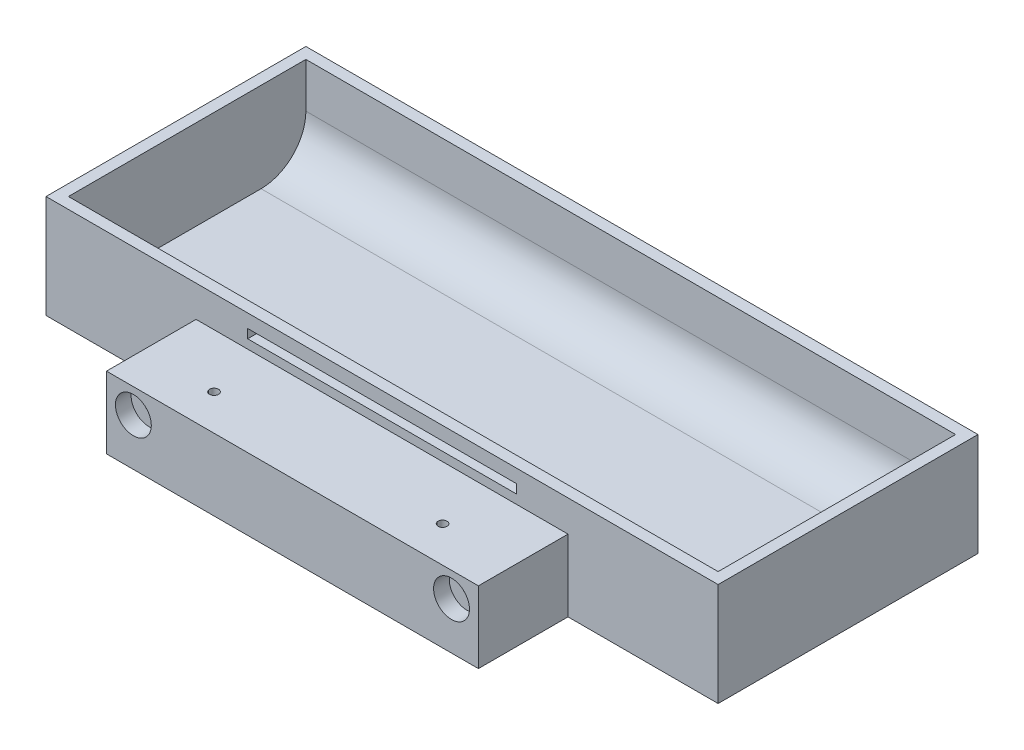
ISO-10303-21;
HEADER;
FILE_DESCRIPTION(('STEP AP214'),'2;1');
FILE_NAME('part.step','',(''),(''),'','','');
FILE_SCHEMA(('AUTOMOTIVE_DESIGN { 1 0 10303 214 1 1 1 1 }'));
ENDSEC;
DATA;
#1=APPLICATION_CONTEXT('core data for automotive mechanical design processes');
#2=APPLICATION_PROTOCOL_DEFINITION('international standard','automotive_design',2000,#1);
#3=PRODUCT_CONTEXT('',#1,'mechanical');
#4=PRODUCT('Part','Part','',(#3));
#5=PRODUCT_RELATED_PRODUCT_CATEGORY('part','',(#4));
#6=PRODUCT_DEFINITION_FORMATION('','',#4);
#7=PRODUCT_DEFINITION_CONTEXT('part definition',#1,'design');
#8=PRODUCT_DEFINITION('design','',#6,#7);
#9=PRODUCT_DEFINITION_SHAPE('','',#8);
#10=(LENGTH_UNIT() NAMED_UNIT(*) SI_UNIT(.MILLI.,.METRE.));
#11=(NAMED_UNIT(*) PLANE_ANGLE_UNIT() SI_UNIT($,.RADIAN.));
#12=(NAMED_UNIT(*) SI_UNIT($,.STERADIAN.) SOLID_ANGLE_UNIT());
#13=UNCERTAINTY_MEASURE_WITH_UNIT(LENGTH_MEASURE(1.E-05),#10,'distance_accuracy_value','');
#14=(GEOMETRIC_REPRESENTATION_CONTEXT(3) GLOBAL_UNCERTAINTY_ASSIGNED_CONTEXT((#13)) GLOBAL_UNIT_ASSIGNED_CONTEXT((#10,
#11,#12)) REPRESENTATION_CONTEXT('',''));
#15=CARTESIAN_POINT('',(0.,0.,0.));
#16=DIRECTION('',(0.,0.,1.));
#17=DIRECTION('',(1.,0.,0.));
#18=AXIS2_PLACEMENT_3D('',#15,#16,#17);
#19=CARTESIAN_POINT('',(0.,0.,-10.));
#20=DIRECTION('',(0.,0.,-1.));
#21=DIRECTION('',(-1.,0.,0.));
#22=AXIS2_PLACEMENT_3D('',#19,#20,#21);
#23=PLANE('',#22);
#24=DIRECTION('',(0.,-1.,0.));
#25=VECTOR('',#24,1.);
#26=CARTESIAN_POINT('',(75.,3.,-10.));
#27=LINE('',#26,#25);
#28=CARTESIAN_POINT('',(75.,23.,-10.));
#29=VERTEX_POINT('',#28);
#30=CARTESIAN_POINT('',(75.,0.,-10.));
#31=VERTEX_POINT('',#30);
#32=EDGE_CURVE('E300',#29,#31,#27,.T.);
#33=ORIENTED_EDGE('',*,*,#32,.F.);
#34=DIRECTION('',(1.,0.,0.));
#35=VECTOR('',#34,1.);
#36=CARTESIAN_POINT('',(-75.,23.,-10.));
#37=LINE('',#36,#35);
#38=CARTESIAN_POINT('',(-75.,23.,-10.));
#39=VERTEX_POINT('',#38);
#40=EDGE_CURVE('E281',#39,#29,#37,.T.);
#41=ORIENTED_EDGE('',*,*,#40,.F.);
#42=DIRECTION('',(0.,1.,0.));
#43=VECTOR('',#42,1.);
#44=CARTESIAN_POINT('',(-75.,3.,-10.));
#45=LINE('',#44,#43);
#46=CARTESIAN_POINT('',(-75.,0.,-10.));
#47=VERTEX_POINT('',#46);
#48=EDGE_CURVE('E290',#47,#39,#45,.T.);
#49=ORIENTED_EDGE('',*,*,#48,.F.);
#50=DIRECTION('',(-1.,0.,0.));
#51=VECTOR('',#50,1.);
#52=CARTESIAN_POINT('',(75.,0.,-10.));
#53=LINE('',#52,#51);
#54=CARTESIAN_POINT('',(-41.5,0.,-10.));
#55=VERTEX_POINT('',#54);
#56=EDGE_CURVE('E302',#55,#47,#53,.T.);
#57=ORIENTED_EDGE('',*,*,#56,.F.);
#58=DIRECTION('',(0.,-1.,0.));
#59=VECTOR('',#58,1.);
#60=CARTESIAN_POINT('',(-41.5,16.,-10.));
#61=LINE('',#60,#59);
#62=CARTESIAN_POINT('',(-41.5,16.,-10.));
#63=VERTEX_POINT('',#62);
#64=EDGE_CURVE('E367',#63,#55,#61,.T.);
#65=ORIENTED_EDGE('',*,*,#64,.F.);
#66=DIRECTION('',(-1.,0.,0.));
#67=VECTOR('',#66,1.);
#68=CARTESIAN_POINT('',(-41.5,16.,-10.));
#69=LINE('',#68,#67);
#70=CARTESIAN_POINT('',(41.5,16.,-10.));
#71=VERTEX_POINT('',#70);
#72=EDGE_CURVE('E349',#71,#63,#69,.T.);
#73=ORIENTED_EDGE('',*,*,#72,.F.);
#74=DIRECTION('',(0.,-1.,0.));
#75=VECTOR('',#74,1.);
#76=CARTESIAN_POINT('',(41.5,16.,-10.));
#77=LINE('',#76,#75);
#78=CARTESIAN_POINT('',(41.5,0.,-10.));
#79=VERTEX_POINT('',#78);
#80=EDGE_CURVE('E369',#71,#79,#77,.T.);
#81=ORIENTED_EDGE('',*,*,#80,.T.);
#82=EDGE_CURVE('E294',#31,#79,#53,.T.);
#83=ORIENTED_EDGE('',*,*,#82,.F.);
#84=EDGE_LOOP('',(#33,#41,#49,#57,#65,#73,#81,#83));
#85=FACE_BOUND('',#84,.T.);
#86=DIRECTION('',(0.,1.,0.));
#87=VECTOR('',#86,1.);
#88=CARTESIAN_POINT('',(30.,18.,-10.));
#89=LINE('',#88,#87);
#90=CARTESIAN_POINT('',(30.,18.,-10.));
#91=VERTEX_POINT('',#90);
#92=CARTESIAN_POINT('',(30.,20.,-10.));
#93=VERTEX_POINT('',#92);
#94=EDGE_CURVE('E233',#91,#93,#89,.T.);
#95=ORIENTED_EDGE('',*,*,#94,.F.);
#96=DIRECTION('',(-1.,0.,0.));
#97=VECTOR('',#96,1.);
#98=CARTESIAN_POINT('',(30.,18.,-10.));
#99=LINE('',#98,#97);
#100=CARTESIAN_POINT('',(-30.,18.,-10.));
#101=VERTEX_POINT('',#100);
#102=EDGE_CURVE('E226',#91,#101,#99,.T.);
#103=ORIENTED_EDGE('',*,*,#102,.T.);
#104=DIRECTION('',(0.,1.,0.));
#105=VECTOR('',#104,1.);
#106=CARTESIAN_POINT('',(-30.,18.,-10.));
#107=LINE('',#106,#105);
#108=CARTESIAN_POINT('',(-30.,20.,-10.));
#109=VERTEX_POINT('',#108);
#110=EDGE_CURVE('E237',#101,#109,#107,.T.);
#111=ORIENTED_EDGE('',*,*,#110,.T.);
#112=DIRECTION('',(-1.,0.,0.));
#113=VECTOR('',#112,1.);
#114=CARTESIAN_POINT('',(30.,20.,-10.));
#115=LINE('',#114,#113);
#116=EDGE_CURVE('E219',#93,#109,#115,.T.);
#117=ORIENTED_EDGE('',*,*,#116,.F.);
#118=EDGE_LOOP('',(#95,#103,#111,#117));
#119=FACE_BOUND('',#118,.T.);
#120=ADVANCED_FACE('F39',(#85,#119),#23,.F.);
#121=CARTESIAN_POINT('',(41.5,16.,-10.));
#122=DIRECTION('',(-1.,0.,0.));
#123=DIRECTION('',(0.,0.,1.));
#124=AXIS2_PLACEMENT_3D('',#121,#122,#123);
#125=PLANE('',#124);
#126=DIRECTION('',(0.,0.,-1.));
#127=VECTOR('',#126,1.);
#128=CARTESIAN_POINT('',(41.5,0.,-10.));
#129=LINE('',#128,#127);
#130=CARTESIAN_POINT('',(41.5,0.,10.));
#131=VERTEX_POINT('',#130);
#132=EDGE_CURVE('E338',#131,#79,#129,.T.);
#133=ORIENTED_EDGE('',*,*,#132,.T.);
#134=ORIENTED_EDGE('',*,*,#80,.F.);
#135=DIRECTION('',(0.,0.,-1.));
#136=VECTOR('',#135,1.);
#137=CARTESIAN_POINT('',(41.5,16.,-10.));
#138=LINE('',#137,#136);
#139=CARTESIAN_POINT('',(41.5,16.,10.));
#140=VERTEX_POINT('',#139);
#141=EDGE_CURVE('E347',#140,#71,#138,.T.);
#142=ORIENTED_EDGE('',*,*,#141,.F.);
#143=DIRECTION('',(0.,-1.,0.));
#144=VECTOR('',#143,1.);
#145=CARTESIAN_POINT('',(41.5,16.,10.));
#146=LINE('',#145,#144);
#147=EDGE_CURVE('E356',#140,#131,#146,.T.);
#148=ORIENTED_EDGE('',*,*,#147,.T.);
#149=EDGE_LOOP('',(#133,#134,#142,#148));
#150=FACE_BOUND('',#149,.T.);
#151=ADVANCED_FACE('F424',(#150),#125,.F.);
#152=CARTESIAN_POINT('',(-41.5,16.,-10.));
#153=DIRECTION('',(1.,0.,0.));
#154=DIRECTION('',(0.,0.,-1.));
#155=AXIS2_PLACEMENT_3D('',#152,#153,#154);
#156=PLANE('',#155);
#157=DIRECTION('',(0.,0.,1.));
#158=VECTOR('',#157,1.);
#159=CARTESIAN_POINT('',(-41.5,0.,-10.));
#160=LINE('',#159,#158);
#161=CARTESIAN_POINT('',(-41.5,0.,10.));
#162=VERTEX_POINT('',#161);
#163=EDGE_CURVE('E359',#55,#162,#160,.T.);
#164=ORIENTED_EDGE('',*,*,#163,.T.);
#165=DIRECTION('',(0.,-1.,0.));
#166=VECTOR('',#165,1.);
#167=CARTESIAN_POINT('',(-41.5,16.,10.));
#168=LINE('',#167,#166);
#169=CARTESIAN_POINT('',(-41.5,16.,10.));
#170=VERTEX_POINT('',#169);
#171=EDGE_CURVE('E364',#170,#162,#168,.T.);
#172=ORIENTED_EDGE('',*,*,#171,.F.);
#173=DIRECTION('',(0.,0.,1.));
#174=VECTOR('',#173,1.);
#175=CARTESIAN_POINT('',(-41.5,16.,-10.));
#176=LINE('',#175,#174);
#177=EDGE_CURVE('E352',#63,#170,#176,.T.);
#178=ORIENTED_EDGE('',*,*,#177,.F.);
#179=ORIENTED_EDGE('',*,*,#64,.T.);
#180=EDGE_LOOP('',(#164,#172,#178,#179));
#181=FACE_BOUND('',#180,.T.);
#182=ADVANCED_FACE('F431',(#181),#156,.F.);
#183=CARTESIAN_POINT('',(-41.5,16.,10.));
#184=DIRECTION('',(0.,0.,-1.));
#185=DIRECTION('',(-1.,0.,0.));
#186=AXIS2_PLACEMENT_3D('',#183,#184,#185);
#187=PLANE('',#186);
#188=CARTESIAN_POINT('',(-35.5,10.5,10.));
#189=DIRECTION('',(0.,0.,1.));
#190=DIRECTION('',(1.,0.,0.));
#191=AXIS2_PLACEMENT_3D('',#188,#189,#190);
#192=CIRCLE('',#191,4.00000000000001);
#193=CARTESIAN_POINT('',(-31.5,10.5,10.));
#194=VERTEX_POINT('',#193);
#195=EDGE_CURVE('E339',#194,#194,#192,.T.);
#196=ORIENTED_EDGE('',*,*,#195,.F.);
#197=EDGE_LOOP('',(#196));
#198=FACE_BOUND('',#197,.T.);
#199=CARTESIAN_POINT('',(35.5,10.5,10.));
#200=DIRECTION('',(0.,0.,1.));
#201=DIRECTION('',(1.,0.,0.));
#202=AXIS2_PLACEMENT_3D('',#199,#200,#201);
#203=CIRCLE('',#202,4.00000000000001);
#204=CARTESIAN_POINT('',(39.5,10.5,10.));
#205=VERTEX_POINT('',#204);
#206=EDGE_CURVE('E342',#205,#205,#203,.T.);
#207=ORIENTED_EDGE('',*,*,#206,.F.);
#208=EDGE_LOOP('',(#207));
#209=FACE_BOUND('',#208,.T.);
#210=DIRECTION('',(1.,0.,0.));
#211=VECTOR('',#210,1.);
#212=CARTESIAN_POINT('',(-41.5,0.,10.));
#213=LINE('',#212,#211);
#214=EDGE_CURVE('E350',#162,#131,#213,.T.);
#215=ORIENTED_EDGE('',*,*,#214,.T.);
#216=ORIENTED_EDGE('',*,*,#147,.F.);
#217=DIRECTION('',(1.,0.,0.));
#218=VECTOR('',#217,1.);
#219=CARTESIAN_POINT('',(-41.5,16.,10.));
#220=LINE('',#219,#218);
#221=EDGE_CURVE('E354',#170,#140,#220,.T.);
#222=ORIENTED_EDGE('',*,*,#221,.F.);
#223=ORIENTED_EDGE('',*,*,#171,.T.);
#224=EDGE_LOOP('',(#215,#216,#222,#223));
#225=FACE_BOUND('',#224,.T.);
#226=ADVANCED_FACE('F500',(#198,#209,#225),#187,.F.);
#227=CARTESIAN_POINT('',(0.,16.,0.));
#228=DIRECTION('',(0.,1.,0.));
#229=DIRECTION('',(0.,0.,1.));
#230=AXIS2_PLACEMENT_3D('',#227,#228,#229);
#231=PLANE('',#230);
#232=CARTESIAN_POINT('',(-25.5,16.,2.));
#233=DIRECTION('',(0.,1.,0.));
#234=DIRECTION('',(0.,0.,1.));
#235=AXIS2_PLACEMENT_3D('',#232,#233,#234);
#236=CIRCLE('',#235,1.);
#237=CARTESIAN_POINT('',(-25.5,16.,3.));
#238=VERTEX_POINT('',#237);
#239=EDGE_CURVE('E327',#238,#238,#236,.T.);
#240=ORIENTED_EDGE('',*,*,#239,.F.);
#241=EDGE_LOOP('',(#240));
#242=FACE_BOUND('',#241,.T.);
#243=CARTESIAN_POINT('',(25.5,16.,2.));
#244=DIRECTION('',(0.,1.,0.));
#245=DIRECTION('',(0.,0.,1.));
#246=AXIS2_PLACEMENT_3D('',#243,#244,#245);
#247=CIRCLE('',#246,1.);
#248=CARTESIAN_POINT('',(25.5,16.,3.));
#249=VERTEX_POINT('',#248);
#250=EDGE_CURVE('E330',#249,#249,#247,.T.);
#251=ORIENTED_EDGE('',*,*,#250,.F.);
#252=EDGE_LOOP('',(#251));
#253=FACE_BOUND('',#252,.T.);
#254=ORIENTED_EDGE('',*,*,#141,.T.);
#255=ORIENTED_EDGE('',*,*,#72,.T.);
#256=ORIENTED_EDGE('',*,*,#177,.T.);
#257=ORIENTED_EDGE('',*,*,#221,.T.);
#258=EDGE_LOOP('',(#254,#255,#256,#257));
#259=FACE_BOUND('',#258,.T.);
#260=ADVANCED_FACE('F497',(#242,#253,#259),#231,.T.);
#261=CARTESIAN_POINT('',(0.,0.,0.));
#262=DIRECTION('',(0.,1.,0.));
#263=DIRECTION('',(0.,0.,1.));
#264=AXIS2_PLACEMENT_3D('',#261,#262,#263);
#265=PLANE('',#264);
#266=ORIENTED_EDGE('',*,*,#132,.F.);
#267=ORIENTED_EDGE('',*,*,#214,.F.);
#268=ORIENTED_EDGE('',*,*,#163,.F.);
#269=ORIENTED_EDGE('',*,*,#56,.T.);
#270=DIRECTION('',(0.,0.,1.));
#271=VECTOR('',#270,1.);
#272=CARTESIAN_POINT('',(-75.,0.,-68.));
#273=LINE('',#272,#271);
#274=CARTESIAN_POINT('',(-75.,0.,-68.));
#275=VERTEX_POINT('',#274);
#276=EDGE_CURVE('E298',#275,#47,#273,.T.);
#277=ORIENTED_EDGE('',*,*,#276,.F.);
#278=DIRECTION('',(-1.,0.,0.));
#279=VECTOR('',#278,1.);
#280=CARTESIAN_POINT('',(75.,0.,-68.));
#281=LINE('',#280,#279);
#282=CARTESIAN_POINT('',(75.,0.,-68.));
#283=VERTEX_POINT('',#282);
#284=EDGE_CURVE('E296',#283,#275,#281,.T.);
#285=ORIENTED_EDGE('',*,*,#284,.F.);
#286=DIRECTION('',(0.,0.,1.));
#287=VECTOR('',#286,1.);
#288=CARTESIAN_POINT('',(75.,0.,-68.));
#289=LINE('',#288,#287);
#290=EDGE_CURVE('E307',#283,#31,#289,.T.);
#291=ORIENTED_EDGE('',*,*,#290,.T.);
#292=ORIENTED_EDGE('',*,*,#82,.T.);
#293=EDGE_LOOP('',(#266,#267,#268,#269,#277,#285,#291,#292));
#294=FACE_BOUND('',#293,.T.);
#295=ADVANCED_FACE('F492',(#294),#265,.F.);
#296=CARTESIAN_POINT('',(35.5,10.5,6.5));
#297=DIRECTION('',(0.,0.,1.));
#298=DIRECTION('',(1.,0.,0.));
#299=AXIS2_PLACEMENT_3D('',#296,#297,#298);
#300=CYLINDRICAL_SURFACE('',#299,4.00000000000001);
#301=CARTESIAN_POINT('',(35.5,10.5,6.5));
#302=DIRECTION('',(0.,0.,1.));
#303=DIRECTION('',(1.,0.,0.));
#304=AXIS2_PLACEMENT_3D('',#301,#302,#303);
#305=CIRCLE('',#304,4.00000000000001);
#306=CARTESIAN_POINT('',(39.5,10.5,6.5));
#307=VERTEX_POINT('',#306);
#308=EDGE_CURVE('E326',#307,#307,#305,.T.);
#309=ORIENTED_EDGE('',*,*,#308,.F.);
#310=EDGE_LOOP('',(#309));
#311=FACE_BOUND('',#310,.T.);
#312=ORIENTED_EDGE('',*,*,#206,.T.);
#313=EDGE_LOOP('',(#312));
#314=FACE_BOUND('',#313,.T.);
#315=ADVANCED_FACE('F489',(#311,#314),#300,.F.);
#316=CARTESIAN_POINT('',(35.5,10.5,6.5));
#317=DIRECTION('',(0.,0.,1.));
#318=DIRECTION('',(1.,0.,0.));
#319=AXIS2_PLACEMENT_3D('',#316,#317,#318);
#320=PLANE('',#319);
#321=CARTESIAN_POINT('',(35.5,10.5,6.5));
#322=DIRECTION('',(0.,0.,1.));
#323=DIRECTION('',(1.,0.,0.));
#324=AXIS2_PLACEMENT_3D('',#321,#322,#323);
#325=CIRCLE('',#324,0.999999999999998);
#326=CARTESIAN_POINT('',(36.5,10.5,6.5));
#327=VERTEX_POINT('',#326);
#328=EDGE_CURVE('E318',#327,#327,#325,.T.);
#329=ORIENTED_EDGE('',*,*,#328,.F.);
#330=EDGE_LOOP('',(#329));
#331=FACE_BOUND('',#330,.T.);
#332=ORIENTED_EDGE('',*,*,#308,.T.);
#333=EDGE_LOOP('',(#332));
#334=FACE_BOUND('',#333,.T.);
#335=ADVANCED_FACE('F487',(#331,#334),#320,.T.);
#336=CARTESIAN_POINT('',(-35.5,10.5,6.5));
#337=DIRECTION('',(0.,0.,1.));
#338=DIRECTION('',(1.,0.,0.));
#339=AXIS2_PLACEMENT_3D('',#336,#337,#338);
#340=CYLINDRICAL_SURFACE('',#339,4.00000000000001);
#341=CARTESIAN_POINT('',(-35.5,10.5,6.5));
#342=DIRECTION('',(0.,0.,1.));
#343=DIRECTION('',(1.,0.,0.));
#344=AXIS2_PLACEMENT_3D('',#341,#342,#343);
#345=CIRCLE('',#344,4.00000000000001);
#346=CARTESIAN_POINT('',(-31.5,10.5,6.5));
#347=VERTEX_POINT('',#346);
#348=EDGE_CURVE('E335',#347,#347,#345,.T.);
#349=ORIENTED_EDGE('',*,*,#348,.F.);
#350=EDGE_LOOP('',(#349));
#351=FACE_BOUND('',#350,.T.);
#352=ORIENTED_EDGE('',*,*,#195,.T.);
#353=EDGE_LOOP('',(#352));
#354=FACE_BOUND('',#353,.T.);
#355=ADVANCED_FACE('F483',(#351,#354),#340,.F.);
#356=CARTESIAN_POINT('',(-35.5,10.5,6.5));
#357=DIRECTION('',(0.,0.,1.));
#358=DIRECTION('',(1.,0.,0.));
#359=AXIS2_PLACEMENT_3D('',#356,#357,#358);
#360=PLANE('',#359);
#361=CARTESIAN_POINT('',(-35.5,10.5,6.5));
#362=DIRECTION('',(0.,0.,1.));
#363=DIRECTION('',(1.,0.,0.));
#364=AXIS2_PLACEMENT_3D('',#361,#362,#363);
#365=CIRCLE('',#364,0.999999999999998);
#366=CARTESIAN_POINT('',(-34.5,10.5,6.5));
#367=VERTEX_POINT('',#366);
#368=EDGE_CURVE('E315',#367,#367,#365,.T.);
#369=ORIENTED_EDGE('',*,*,#368,.F.);
#370=EDGE_LOOP('',(#369));
#371=FACE_BOUND('',#370,.T.);
#372=ORIENTED_EDGE('',*,*,#348,.T.);
#373=EDGE_LOOP('',(#372));
#374=FACE_BOUND('',#373,.T.);
#375=ADVANCED_FACE('F476',(#371,#374),#360,.T.);
#376=CARTESIAN_POINT('',(25.5,6.,2.));
#377=DIRECTION('',(0.,1.,0.));
#378=DIRECTION('',(0.,0.,1.));
#379=AXIS2_PLACEMENT_3D('',#376,#377,#378);
#380=CYLINDRICAL_SURFACE('',#379,1.);
#381=CARTESIAN_POINT('',(25.5,6.,2.));
#382=DIRECTION('',(0.,1.,0.));
#383=DIRECTION('',(0.,0.,1.));
#384=AXIS2_PLACEMENT_3D('',#381,#382,#383);
#385=CIRCLE('',#384,1.);
#386=CARTESIAN_POINT('',(25.5,6.,3.));
#387=VERTEX_POINT('',#386);
#388=EDGE_CURVE('E314',#387,#387,#385,.T.);
#389=ORIENTED_EDGE('',*,*,#388,.F.);
#390=EDGE_LOOP('',(#389));
#391=FACE_BOUND('',#390,.T.);
#392=ORIENTED_EDGE('',*,*,#250,.T.);
#393=EDGE_LOOP('',(#392));
#394=FACE_BOUND('',#393,.T.);
#395=ADVANCED_FACE('F473',(#391,#394),#380,.F.);
#396=CARTESIAN_POINT('',(25.5,6.,2.));
#397=DIRECTION('',(0.,1.,0.));
#398=DIRECTION('',(0.,0.,1.));
#399=AXIS2_PLACEMENT_3D('',#396,#397,#398);
#400=PLANE('',#399);
#401=ORIENTED_EDGE('',*,*,#388,.T.);
#402=EDGE_LOOP('',(#401));
#403=FACE_BOUND('',#402,.T.);
#404=ADVANCED_FACE('F471',(#403),#400,.T.);
#405=CARTESIAN_POINT('',(-25.5,6.,2.));
#406=DIRECTION('',(0.,1.,0.));
#407=DIRECTION('',(0.,0.,1.));
#408=AXIS2_PLACEMENT_3D('',#405,#406,#407);
#409=CYLINDRICAL_SURFACE('',#408,1.);
#410=CARTESIAN_POINT('',(-25.5,6.,2.));
#411=DIRECTION('',(0.,1.,0.));
#412=DIRECTION('',(0.,0.,1.));
#413=AXIS2_PLACEMENT_3D('',#410,#411,#412);
#414=CIRCLE('',#413,1.);
#415=CARTESIAN_POINT('',(-25.5,6.,3.));
#416=VERTEX_POINT('',#415);
#417=EDGE_CURVE('E323',#416,#416,#414,.T.);
#418=ORIENTED_EDGE('',*,*,#417,.F.);
#419=EDGE_LOOP('',(#418));
#420=FACE_BOUND('',#419,.T.);
#421=ORIENTED_EDGE('',*,*,#239,.T.);
#422=EDGE_LOOP('',(#421));
#423=FACE_BOUND('',#422,.T.);
#424=ADVANCED_FACE('F467',(#420,#423),#409,.F.);
#425=CARTESIAN_POINT('',(-25.5,6.,2.));
#426=DIRECTION('',(0.,1.,0.));
#427=DIRECTION('',(0.,0.,1.));
#428=AXIS2_PLACEMENT_3D('',#425,#426,#427);
#429=PLANE('',#428);
#430=ORIENTED_EDGE('',*,*,#417,.T.);
#431=EDGE_LOOP('',(#430));
#432=FACE_BOUND('',#431,.T.);
#433=ADVANCED_FACE('F457',(#432),#429,.T.);
#434=CARTESIAN_POINT('',(-35.5,10.5,-1.5));
#435=DIRECTION('',(0.,0.,1.));
#436=DIRECTION('',(1.,0.,0.));
#437=AXIS2_PLACEMENT_3D('',#434,#435,#436);
#438=CYLINDRICAL_SURFACE('',#437,0.999999999999998);
#439=CARTESIAN_POINT('',(-35.5,10.5,-1.5));
#440=DIRECTION('',(0.,0.,1.));
#441=DIRECTION('',(1.,0.,0.));
#442=AXIS2_PLACEMENT_3D('',#439,#440,#441);
#443=CIRCLE('',#442,0.999999999999998);
#444=CARTESIAN_POINT('',(-34.5,10.5,-1.5));
#445=VERTEX_POINT('',#444);
#446=EDGE_CURVE('E311',#445,#445,#443,.T.);
#447=ORIENTED_EDGE('',*,*,#446,.F.);
#448=EDGE_LOOP('',(#447));
#449=FACE_BOUND('',#448,.T.);
#450=ORIENTED_EDGE('',*,*,#368,.T.);
#451=EDGE_LOOP('',(#450));
#452=FACE_BOUND('',#451,.T.);
#453=ADVANCED_FACE('F453',(#449,#452),#438,.F.);
#454=CARTESIAN_POINT('',(-35.5,10.5,-1.5));
#455=DIRECTION('',(0.,0.,1.));
#456=DIRECTION('',(1.,0.,0.));
#457=AXIS2_PLACEMENT_3D('',#454,#455,#456);
#458=PLANE('',#457);
#459=ORIENTED_EDGE('',*,*,#446,.T.);
#460=EDGE_LOOP('',(#459));
#461=FACE_BOUND('',#460,.T.);
#462=ADVANCED_FACE('F449',(#461),#458,.T.);
#463=CARTESIAN_POINT('',(35.5,10.5,-1.5));
#464=DIRECTION('',(0.,0.,1.));
#465=DIRECTION('',(1.,0.,0.));
#466=AXIS2_PLACEMENT_3D('',#463,#464,#465);
#467=CYLINDRICAL_SURFACE('',#466,0.999999999999998);
#468=CARTESIAN_POINT('',(35.5,10.5,-1.5));
#469=DIRECTION('',(0.,0.,1.));
#470=DIRECTION('',(1.,0.,0.));
#471=AXIS2_PLACEMENT_3D('',#468,#469,#470);
#472=CIRCLE('',#471,0.999999999999998);
#473=CARTESIAN_POINT('',(36.5,10.5,-1.5));
#474=VERTEX_POINT('',#473);
#475=EDGE_CURVE('E310',#474,#474,#472,.T.);
#476=ORIENTED_EDGE('',*,*,#475,.F.);
#477=EDGE_LOOP('',(#476));
#478=FACE_BOUND('',#477,.T.);
#479=ORIENTED_EDGE('',*,*,#328,.T.);
#480=EDGE_LOOP('',(#479));
#481=FACE_BOUND('',#480,.T.);
#482=ADVANCED_FACE('F452',(#478,#481),#467,.F.);
#483=CARTESIAN_POINT('',(35.5,10.5,-1.5));
#484=DIRECTION('',(0.,0.,1.));
#485=DIRECTION('',(1.,0.,0.));
#486=AXIS2_PLACEMENT_3D('',#483,#484,#485);
#487=PLANE('',#486);
#488=ORIENTED_EDGE('',*,*,#475,.T.);
#489=EDGE_LOOP('',(#488));
#490=FACE_BOUND('',#489,.T.);
#491=ADVANCED_FACE('F447',(#490),#487,.T.);
#492=CARTESIAN_POINT('',(-75.,3.,-68.));
#493=DIRECTION('',(1.,0.,0.));
#494=DIRECTION('',(0.,0.,-1.));
#495=AXIS2_PLACEMENT_3D('',#492,#493,#494);
#496=PLANE('',#495);
#497=ORIENTED_EDGE('',*,*,#48,.T.);
#498=DIRECTION('',(0.,0.,1.));
#499=VECTOR('',#498,1.);
#500=CARTESIAN_POINT('',(-75.,23.,-68.));
#501=LINE('',#500,#499);
#502=CARTESIAN_POINT('',(-75.,23.,-68.));
#503=VERTEX_POINT('',#502);
#504=EDGE_CURVE('E278',#503,#39,#501,.T.);
#505=ORIENTED_EDGE('',*,*,#504,.F.);
#506=DIRECTION('',(0.,1.,0.));
#507=VECTOR('',#506,1.);
#508=CARTESIAN_POINT('',(-75.,3.,-68.));
#509=LINE('',#508,#507);
#510=EDGE_CURVE('E291',#275,#503,#509,.T.);
#511=ORIENTED_EDGE('',*,*,#510,.F.);
#512=ORIENTED_EDGE('',*,*,#276,.T.);
#513=EDGE_LOOP('',(#497,#505,#511,#512));
#514=FACE_BOUND('',#513,.T.);
#515=ADVANCED_FACE('F441',(#514),#496,.F.);
#516=CARTESIAN_POINT('',(75.,3.,-68.));
#517=DIRECTION('',(-1.,0.,0.));
#518=DIRECTION('',(0.,0.,1.));
#519=AXIS2_PLACEMENT_3D('',#516,#517,#518);
#520=PLANE('',#519);
#521=ORIENTED_EDGE('',*,*,#32,.T.);
#522=ORIENTED_EDGE('',*,*,#290,.F.);
#523=DIRECTION('',(0.,-1.,0.));
#524=VECTOR('',#523,1.);
#525=CARTESIAN_POINT('',(75.,3.,-68.));
#526=LINE('',#525,#524);
#527=CARTESIAN_POINT('',(75.,23.,-68.));
#528=VERTEX_POINT('',#527);
#529=EDGE_CURVE('E293',#528,#283,#526,.T.);
#530=ORIENTED_EDGE('',*,*,#529,.F.);
#531=DIRECTION('',(0.,0.,-1.));
#532=VECTOR('',#531,1.);
#533=CARTESIAN_POINT('',(75.,23.,-68.));
#534=LINE('',#533,#532);
#535=EDGE_CURVE('E284',#29,#528,#534,.T.);
#536=ORIENTED_EDGE('',*,*,#535,.F.);
#537=EDGE_LOOP('',(#521,#522,#530,#536));
#538=FACE_BOUND('',#537,.T.);
#539=ADVANCED_FACE('F438',(#538),#520,.F.);
#540=CARTESIAN_POINT('',(0.,0.,-68.));
#541=DIRECTION('',(0.,0.,-1.));
#542=DIRECTION('',(-1.,0.,0.));
#543=AXIS2_PLACEMENT_3D('',#540,#541,#542);
#544=PLANE('',#543);
#545=DIRECTION('',(0.,-1.,0.));
#546=VECTOR('',#545,1.);
#547=CARTESIAN_POINT('',(30.,18.,-68.));
#548=LINE('',#547,#546);
#549=CARTESIAN_POINT('',(30.,20.,-68.));
#550=VERTEX_POINT('',#549);
#551=CARTESIAN_POINT('',(30.,18.,-68.));
#552=VERTEX_POINT('',#551);
#553=EDGE_CURVE('E199',#550,#552,#548,.T.);
#554=ORIENTED_EDGE('',*,*,#553,.F.);
#555=DIRECTION('',(-1.,0.,0.));
#556=VECTOR('',#555,1.);
#557=CARTESIAN_POINT('',(30.,20.,-68.));
#558=LINE('',#557,#556);
#559=CARTESIAN_POINT('',(-30.,20.,-68.));
#560=VERTEX_POINT('',#559);
#561=EDGE_CURVE('E264',#550,#560,#558,.T.);
#562=ORIENTED_EDGE('',*,*,#561,.T.);
#563=DIRECTION('',(0.,-1.,0.));
#564=VECTOR('',#563,1.);
#565=CARTESIAN_POINT('',(-30.,18.,-68.));
#566=LINE('',#565,#564);
#567=CARTESIAN_POINT('',(-30.,18.,-68.));
#568=VERTEX_POINT('',#567);
#569=EDGE_CURVE('E212',#560,#568,#566,.T.);
#570=ORIENTED_EDGE('',*,*,#569,.T.);
#571=DIRECTION('',(-1.,0.,0.));
#572=VECTOR('',#571,1.);
#573=CARTESIAN_POINT('',(30.,18.,-68.));
#574=LINE('',#573,#572);
#575=EDGE_CURVE('E192',#552,#568,#574,.T.);
#576=ORIENTED_EDGE('',*,*,#575,.F.);
#577=EDGE_LOOP('',(#554,#562,#570,#576));
#578=FACE_BOUND('',#577,.T.);
#579=ORIENTED_EDGE('',*,*,#510,.T.);
#580=DIRECTION('',(-1.,0.,0.));
#581=VECTOR('',#580,1.);
#582=CARTESIAN_POINT('',(-75.,23.,-68.));
#583=LINE('',#582,#581);
#584=EDGE_CURVE('E287',#528,#503,#583,.T.);
#585=ORIENTED_EDGE('',*,*,#584,.F.);
#586=ORIENTED_EDGE('',*,*,#529,.T.);
#587=ORIENTED_EDGE('',*,*,#284,.T.);
#588=EDGE_LOOP('',(#579,#585,#586,#587));
#589=FACE_BOUND('',#588,.T.);
#590=ADVANCED_FACE('F210',(#578,#589),#544,.T.);
#591=CARTESIAN_POINT('',(0.,23.,0.));
#592=DIRECTION('',(0.,1.,0.));
#593=DIRECTION('',(0.,0.,1.));
#594=AXIS2_PLACEMENT_3D('',#591,#592,#593);
#595=PLANE('',#594);
#596=ORIENTED_EDGE('',*,*,#504,.T.);
#597=ORIENTED_EDGE('',*,*,#40,.T.);
#598=ORIENTED_EDGE('',*,*,#535,.T.);
#599=ORIENTED_EDGE('',*,*,#584,.T.);
#600=EDGE_LOOP('',(#596,#597,#598,#599));
#601=FACE_BOUND('',#600,.T.);
#602=DIRECTION('',(0.,0.,1.));
#603=VECTOR('',#602,1.);
#604=CARTESIAN_POINT('',(-72.5,23.,-65.5));
#605=LINE('',#604,#603);
#606=CARTESIAN_POINT('',(-72.5,23.,-65.5));
#607=VERTEX_POINT('',#606);
#608=CARTESIAN_POINT('',(-72.5,23.,-12.5));
#609=VERTEX_POINT('',#608);
#610=EDGE_CURVE('E252',#607,#609,#605,.T.);
#611=ORIENTED_EDGE('',*,*,#610,.F.);
#612=DIRECTION('',(-1.,0.,0.));
#613=VECTOR('',#612,1.);
#614=CARTESIAN_POINT('',(-72.5,23.,-65.5));
#615=LINE('',#614,#613);
#616=CARTESIAN_POINT('',(72.5,23.,-65.5));
#617=VERTEX_POINT('',#616);
#618=EDGE_CURVE('E250',#617,#607,#615,.T.);
#619=ORIENTED_EDGE('',*,*,#618,.F.);
#620=DIRECTION('',(0.,0.,-1.));
#621=VECTOR('',#620,1.);
#622=CARTESIAN_POINT('',(72.5,23.,-65.5));
#623=LINE('',#622,#621);
#624=CARTESIAN_POINT('',(72.5,23.,-12.5));
#625=VERTEX_POINT('',#624);
#626=EDGE_CURVE('E258',#625,#617,#623,.T.);
#627=ORIENTED_EDGE('',*,*,#626,.F.);
#628=DIRECTION('',(1.,0.,0.));
#629=VECTOR('',#628,1.);
#630=CARTESIAN_POINT('',(-72.5,23.,-12.5));
#631=LINE('',#630,#629);
#632=EDGE_CURVE('E255',#609,#625,#631,.T.);
#633=ORIENTED_EDGE('',*,*,#632,.F.);
#634=EDGE_LOOP('',(#611,#619,#627,#633));
#635=FACE_BOUND('',#634,.T.);
#636=ADVANCED_FACE('F406',(#601,#635),#595,.T.);
#637=CARTESIAN_POINT('',(-72.5,23.,-65.5));
#638=DIRECTION('',(0.,0.,1.));
#639=DIRECTION('',(1.,0.,0.));
#640=AXIS2_PLACEMENT_3D('',#637,#638,#639);
#641=PLANE('',#640);
#642=DIRECTION('',(0.,-1.,0.));
#643=VECTOR('',#642,1.);
#644=CARTESIAN_POINT('',(-72.5,23.,-65.5));
#645=LINE('',#644,#643);
#646=CARTESIAN_POINT('',(-72.5,13.,-65.5));
#647=VERTEX_POINT('',#646);
#648=EDGE_CURVE('E275',#607,#647,#645,.T.);
#649=ORIENTED_EDGE('',*,*,#648,.T.);
#650=DIRECTION('',(-1.,0.,0.));
#651=VECTOR('',#650,1.);
#652=CARTESIAN_POINT('',(-72.5,13.,-65.5));
#653=LINE('',#652,#651);
#654=CARTESIAN_POINT('',(72.5,13.,-65.5));
#655=VERTEX_POINT('',#654);
#656=EDGE_CURVE('E11',#647,#655,#653,.F.);
#657=ORIENTED_EDGE('',*,*,#656,.T.);
#658=DIRECTION('',(0.,-1.,0.));
#659=VECTOR('',#658,1.);
#660=CARTESIAN_POINT('',(72.5,23.,-65.5));
#661=LINE('',#660,#659);
#662=EDGE_CURVE('E260',#617,#655,#661,.T.);
#663=ORIENTED_EDGE('',*,*,#662,.F.);
#664=ORIENTED_EDGE('',*,*,#618,.T.);
#665=EDGE_LOOP('',(#649,#657,#663,#664));
#666=FACE_BOUND('',#665,.T.);
#667=ADVANCED_FACE('F410',(#666),#641,.T.);
#668=CARTESIAN_POINT('',(-72.5,23.,-65.5));
#669=DIRECTION('',(1.,0.,0.));
#670=DIRECTION('',(0.,0.,-1.));
#671=AXIS2_PLACEMENT_3D('',#668,#669,#670);
#672=PLANE('',#671);
#673=DIRECTION('',(0.,-1.,0.));
#674=VECTOR('',#673,1.);
#675=CARTESIAN_POINT('',(-72.5,23.,-12.5));
#676=LINE('',#675,#674);
#677=CARTESIAN_POINT('',(-72.5,13.,-12.5));
#678=VERTEX_POINT('',#677);
#679=EDGE_CURVE('E272',#609,#678,#676,.T.);
#680=ORIENTED_EDGE('',*,*,#679,.T.);
#681=CARTESIAN_POINT('',(-72.5,13.,-22.5));
#682=DIRECTION('',(1.,0.,0.));
#683=DIRECTION('',(0.,0.,-1.));
#684=AXIS2_PLACEMENT_3D('',#681,#682,#683);
#685=CIRCLE('',#684,10.);
#686=CARTESIAN_POINT('',(-72.5,3.,-22.5));
#687=VERTEX_POINT('',#686);
#688=EDGE_CURVE('E47',#678,#687,#685,.T.);
#689=ORIENTED_EDGE('',*,*,#688,.T.);
#690=DIRECTION('',(0.,0.,1.));
#691=VECTOR('',#690,1.);
#692=CARTESIAN_POINT('',(-72.5,3.,-65.5));
#693=LINE('',#692,#691);
#694=CARTESIAN_POINT('',(-72.5,3.,-55.5));
#695=VERTEX_POINT('',#694);
#696=EDGE_CURVE('E261',#695,#687,#693,.T.);
#697=ORIENTED_EDGE('',*,*,#696,.F.);
#698=CARTESIAN_POINT('',(-72.5,13.,-55.5));
#699=DIRECTION('',(1.,0.,0.));
#700=DIRECTION('',(0.,0.,-1.));
#701=AXIS2_PLACEMENT_3D('',#698,#699,#700);
#702=CIRCLE('',#701,10.);
#703=EDGE_CURVE('E383',#695,#647,#702,.T.);
#704=ORIENTED_EDGE('',*,*,#703,.T.);
#705=ORIENTED_EDGE('',*,*,#648,.F.);
#706=ORIENTED_EDGE('',*,*,#610,.T.);
#707=EDGE_LOOP('',(#680,#689,#697,#704,#705,#706));
#708=FACE_BOUND('',#707,.T.);
#709=ADVANCED_FACE('F387',(#708),#672,.T.);
#710=CARTESIAN_POINT('',(-72.5,23.,-12.5));
#711=DIRECTION('',(0.,0.,-1.));
#712=DIRECTION('',(-1.,0.,0.));
#713=AXIS2_PLACEMENT_3D('',#710,#711,#712);
#714=PLANE('',#713);
#715=DIRECTION('',(0.,-1.,0.));
#716=VECTOR('',#715,1.);
#717=CARTESIAN_POINT('',(72.5,23.,-12.5));
#718=LINE('',#717,#716);
#719=CARTESIAN_POINT('',(72.5,13.,-12.5));
#720=VERTEX_POINT('',#719);
#721=EDGE_CURVE('E269',#625,#720,#718,.T.);
#722=ORIENTED_EDGE('',*,*,#721,.T.);
#723=DIRECTION('',(1.,0.,0.));
#724=VECTOR('',#723,1.);
#725=CARTESIAN_POINT('',(-72.5,13.,-12.5));
#726=LINE('',#725,#724);
#727=EDGE_CURVE('E381',#720,#678,#726,.F.);
#728=ORIENTED_EDGE('',*,*,#727,.T.);
#729=ORIENTED_EDGE('',*,*,#679,.F.);
#730=ORIENTED_EDGE('',*,*,#632,.T.);
#731=EDGE_LOOP('',(#722,#728,#729,#730));
#732=FACE_BOUND('',#731,.T.);
#733=ADVANCED_FACE('F400',(#732),#714,.T.);
#734=CARTESIAN_POINT('',(72.5,23.,-65.5));
#735=DIRECTION('',(-1.,0.,0.));
#736=DIRECTION('',(0.,0.,1.));
#737=AXIS2_PLACEMENT_3D('',#734,#735,#736);
#738=PLANE('',#737);
#739=DIRECTION('',(0.,0.,-1.));
#740=VECTOR('',#739,1.);
#741=CARTESIAN_POINT('',(72.5,3.,-65.5));
#742=LINE('',#741,#740);
#743=CARTESIAN_POINT('',(72.5,3.,-22.5));
#744=VERTEX_POINT('',#743);
#745=CARTESIAN_POINT('',(72.5,3.,-55.5));
#746=VERTEX_POINT('',#745);
#747=EDGE_CURVE('E253',#744,#746,#742,.T.);
#748=ORIENTED_EDGE('',*,*,#747,.F.);
#749=CARTESIAN_POINT('',(72.5,13.,-22.5));
#750=DIRECTION('',(-1.,0.,0.));
#751=DIRECTION('',(0.,0.,1.));
#752=AXIS2_PLACEMENT_3D('',#749,#750,#751);
#753=CIRCLE('',#752,10.);
#754=EDGE_CURVE('E379',#744,#720,#753,.T.);
#755=ORIENTED_EDGE('',*,*,#754,.T.);
#756=ORIENTED_EDGE('',*,*,#721,.F.);
#757=ORIENTED_EDGE('',*,*,#626,.T.);
#758=ORIENTED_EDGE('',*,*,#662,.T.);
#759=CARTESIAN_POINT('',(72.5,13.,-55.5));
#760=DIRECTION('',(-1.,0.,0.));
#761=DIRECTION('',(0.,0.,1.));
#762=AXIS2_PLACEMENT_3D('',#759,#760,#761);
#763=CIRCLE('',#762,10.);
#764=EDGE_CURVE('E377',#655,#746,#763,.T.);
#765=ORIENTED_EDGE('',*,*,#764,.T.);
#766=EDGE_LOOP('',(#748,#755,#756,#757,#758,#765));
#767=FACE_BOUND('',#766,.T.);
#768=ADVANCED_FACE('F398',(#767),#738,.T.);
#769=CARTESIAN_POINT('',(75.,3.,-68.));
#770=DIRECTION('',(0.,-1.,0.));
#771=DIRECTION('',(0.,0.,-1.));
#772=AXIS2_PLACEMENT_3D('',#769,#770,#771);
#773=PLANE('',#772);
#774=ORIENTED_EDGE('',*,*,#696,.T.);
#775=DIRECTION('',(1.,0.,0.));
#776=VECTOR('',#775,1.);
#777=CARTESIAN_POINT('',(75.,3.,-22.5));
#778=LINE('',#777,#776);
#779=EDGE_CURVE('E374',#687,#744,#778,.T.);
#780=ORIENTED_EDGE('',*,*,#779,.T.);
#781=ORIENTED_EDGE('',*,*,#747,.T.);
#782=DIRECTION('',(-1.,0.,0.));
#783=VECTOR('',#782,1.);
#784=CARTESIAN_POINT('',(75.,3.,-55.5));
#785=LINE('',#784,#783);
#786=EDGE_CURVE('E371',#746,#695,#785,.T.);
#787=ORIENTED_EDGE('',*,*,#786,.T.);
#788=EDGE_LOOP('',(#774,#780,#781,#787));
#789=FACE_BOUND('',#788,.T.);
#790=ADVANCED_FACE('F393',(#789),#773,.F.);
#791=CARTESIAN_POINT('',(75.,13.,-22.5));
#792=DIRECTION('',(1.,0.,0.));
#793=DIRECTION('',(0.,0.,-1.));
#794=AXIS2_PLACEMENT_3D('',#791,#792,#793);
#795=CYLINDRICAL_SURFACE('',#794,10.);
#796=ORIENTED_EDGE('',*,*,#688,.F.);
#797=ORIENTED_EDGE('',*,*,#727,.F.);
#798=ORIENTED_EDGE('',*,*,#754,.F.);
#799=ORIENTED_EDGE('',*,*,#779,.F.);
#800=EDGE_LOOP('',(#796,#797,#798,#799));
#801=FACE_BOUND('',#800,.T.);
#802=ADVANCED_FACE('F396',(#801),#795,.F.);
#803=CARTESIAN_POINT('',(75.,13.,-55.5));
#804=DIRECTION('',(-1.,0.,0.));
#805=DIRECTION('',(0.,0.,1.));
#806=AXIS2_PLACEMENT_3D('',#803,#804,#805);
#807=CYLINDRICAL_SURFACE('',#806,10.);
#808=ORIENTED_EDGE('',*,*,#764,.F.);
#809=ORIENTED_EDGE('',*,*,#656,.F.);
#810=ORIENTED_EDGE('',*,*,#703,.F.);
#811=ORIENTED_EDGE('',*,*,#786,.F.);
#812=EDGE_LOOP('',(#808,#809,#810,#811));
#813=FACE_BOUND('',#812,.T.);
#814=ADVANCED_FACE('F41',(#813),#807,.F.);
#815=CARTESIAN_POINT('',(30.,20.,-68.));
#816=DIRECTION('',(0.,1.,0.));
#817=DIRECTION('',(0.,0.,1.));
#818=AXIS2_PLACEMENT_3D('',#815,#816,#817);
#819=PLANE('',#818);
#820=DIRECTION('',(0.,0.,-1.));
#821=VECTOR('',#820,1.);
#822=CARTESIAN_POINT('',(-30.,20.,-68.));
#823=LINE('',#822,#821);
#824=CARTESIAN_POINT('',(-30.,20.,-66.));
#825=VERTEX_POINT('',#824);
#826=EDGE_CURVE('E208',#825,#560,#823,.T.);
#827=ORIENTED_EDGE('',*,*,#826,.T.);
#828=ORIENTED_EDGE('',*,*,#561,.F.);
#829=DIRECTION('',(0.,0.,-1.));
#830=VECTOR('',#829,1.);
#831=CARTESIAN_POINT('',(30.,20.,-68.));
#832=LINE('',#831,#830);
#833=CARTESIAN_POINT('',(30.,20.,-66.));
#834=VERTEX_POINT('',#833);
#835=EDGE_CURVE('E205',#834,#550,#832,.T.);
#836=ORIENTED_EDGE('',*,*,#835,.F.);
#837=DIRECTION('',(-1.,0.,0.));
#838=VECTOR('',#837,1.);
#839=CARTESIAN_POINT('',(30.,20.,-66.));
#840=LINE('',#839,#838);
#841=EDGE_CURVE('E214',#834,#825,#840,.T.);
#842=ORIENTED_EDGE('',*,*,#841,.T.);
#843=EDGE_LOOP('',(#827,#828,#836,#842));
#844=FACE_BOUND('',#843,.T.);
#845=ADVANCED_FACE('F415',(#844),#819,.F.);
#846=CARTESIAN_POINT('',(30.,18.,-66.));
#847=DIRECTION('',(0.,0.,1.));
#848=DIRECTION('',(1.,0.,0.));
#849=AXIS2_PLACEMENT_3D('',#846,#847,#848);
#850=PLANE('',#849);
#851=DIRECTION('',(0.,1.,0.));
#852=VECTOR('',#851,1.);
#853=CARTESIAN_POINT('',(-30.,18.,-66.));
#854=LINE('',#853,#852);
#855=CARTESIAN_POINT('',(-30.,18.,-66.));
#856=VERTEX_POINT('',#855);
#857=EDGE_CURVE('E822',#856,#825,#854,.T.);
#858=ORIENTED_EDGE('',*,*,#857,.T.);
#859=ORIENTED_EDGE('',*,*,#841,.F.);
#860=DIRECTION('',(0.,1.,0.));
#861=VECTOR('',#860,1.);
#862=CARTESIAN_POINT('',(30.,18.,-66.));
#863=LINE('',#862,#861);
#864=CARTESIAN_POINT('',(30.,18.,-66.));
#865=VERTEX_POINT('',#864);
#866=EDGE_CURVE('E198',#865,#834,#863,.T.);
#867=ORIENTED_EDGE('',*,*,#866,.F.);
#868=DIRECTION('',(-1.,0.,0.));
#869=VECTOR('',#868,1.);
#870=CARTESIAN_POINT('',(30.,18.,-66.));
#871=LINE('',#870,#869);
#872=EDGE_CURVE('E194',#865,#856,#871,.T.);
#873=ORIENTED_EDGE('',*,*,#872,.T.);
#874=EDGE_LOOP('',(#858,#859,#867,#873));
#875=FACE_BOUND('',#874,.T.);
#876=ADVANCED_FACE('F421',(#875),#850,.F.);
#877=CARTESIAN_POINT('',(30.,18.,-68.));
#878=DIRECTION('',(0.,-1.,0.));
#879=DIRECTION('',(0.,0.,-1.));
#880=AXIS2_PLACEMENT_3D('',#877,#878,#879);
#881=PLANE('',#880);
#882=DIRECTION('',(0.,0.,1.));
#883=VECTOR('',#882,1.);
#884=CARTESIAN_POINT('',(-30.,18.,-68.));
#885=LINE('',#884,#883);
#886=EDGE_CURVE('E62',#568,#856,#885,.T.);
#887=ORIENTED_EDGE('',*,*,#886,.T.);
#888=ORIENTED_EDGE('',*,*,#872,.F.);
#889=DIRECTION('',(0.,0.,1.));
#890=VECTOR('',#889,1.);
#891=CARTESIAN_POINT('',(30.,18.,-68.));
#892=LINE('',#891,#890);
#893=EDGE_CURVE('E188',#552,#865,#892,.T.);
#894=ORIENTED_EDGE('',*,*,#893,.F.);
#895=ORIENTED_EDGE('',*,*,#575,.T.);
#896=EDGE_LOOP('',(#887,#888,#894,#895));
#897=FACE_BOUND('',#896,.T.);
#898=ADVANCED_FACE('F190',(#897),#881,.F.);
#899=CARTESIAN_POINT('',(30.,0.,0.));
#900=DIRECTION('',(1.,0.,0.));
#901=DIRECTION('',(0.,0.,-1.));
#902=AXIS2_PLACEMENT_3D('',#899,#900,#901);
#903=PLANE('',#902);
#904=ORIENTED_EDGE('',*,*,#553,.T.);
#905=ORIENTED_EDGE('',*,*,#893,.T.);
#906=ORIENTED_EDGE('',*,*,#866,.T.);
#907=ORIENTED_EDGE('',*,*,#835,.T.);
#908=EDGE_LOOP('',(#904,#905,#906,#907));
#909=FACE_BOUND('',#908,.T.);
#910=ADVANCED_FACE('F203',(#909),#903,.F.);
#911=CARTESIAN_POINT('',(-30.,0.,0.));
#912=DIRECTION('',(1.,0.,0.));
#913=DIRECTION('',(0.,0.,-1.));
#914=AXIS2_PLACEMENT_3D('',#911,#912,#913);
#915=PLANE('',#914);
#916=ORIENTED_EDGE('',*,*,#569,.F.);
#917=ORIENTED_EDGE('',*,*,#826,.F.);
#918=ORIENTED_EDGE('',*,*,#857,.F.);
#919=ORIENTED_EDGE('',*,*,#886,.F.);
#920=EDGE_LOOP('',(#916,#917,#918,#919));
#921=FACE_BOUND('',#920,.T.);
#922=ADVANCED_FACE('F561',(#921),#915,.T.);
#923=CARTESIAN_POINT('',(30.,18.,-10.));
#924=DIRECTION('',(0.,-1.,0.));
#925=DIRECTION('',(0.,0.,-1.));
#926=AXIS2_PLACEMENT_3D('',#923,#924,#925);
#927=PLANE('',#926);
#928=DIRECTION('',(0.,0.,1.));
#929=VECTOR('',#928,1.);
#930=CARTESIAN_POINT('',(-30.,18.,-10.));
#931=LINE('',#930,#929);
#932=CARTESIAN_POINT('',(-30.,18.,-12.));
#933=VERTEX_POINT('',#932);
#934=EDGE_CURVE('E229',#933,#101,#931,.T.);
#935=ORIENTED_EDGE('',*,*,#934,.T.);
#936=ORIENTED_EDGE('',*,*,#102,.F.);
#937=DIRECTION('',(0.,0.,1.));
#938=VECTOR('',#937,1.);
#939=CARTESIAN_POINT('',(30.,18.,-10.));
#940=LINE('',#939,#938);
#941=CARTESIAN_POINT('',(30.,18.,-12.));
#942=VERTEX_POINT('',#941);
#943=EDGE_CURVE('E221',#942,#91,#940,.T.);
#944=ORIENTED_EDGE('',*,*,#943,.F.);
#945=DIRECTION('',(-1.,0.,0.));
#946=VECTOR('',#945,1.);
#947=CARTESIAN_POINT('',(30.,18.,-12.));
#948=LINE('',#947,#946);
#949=EDGE_CURVE('E224',#942,#933,#948,.T.);
#950=ORIENTED_EDGE('',*,*,#949,.T.);
#951=EDGE_LOOP('',(#935,#936,#944,#950));
#952=FACE_BOUND('',#951,.T.);
#953=ADVANCED_FACE('F557',(#952),#927,.F.);
#954=CARTESIAN_POINT('',(30.,18.,-12.));
#955=DIRECTION('',(0.,0.,-1.));
#956=DIRECTION('',(-1.,0.,0.));
#957=AXIS2_PLACEMENT_3D('',#954,#955,#956);
#958=PLANE('',#957);
#959=DIRECTION('',(0.,-1.,0.));
#960=VECTOR('',#959,1.);
#961=CARTESIAN_POINT('',(-30.,18.,-12.));
#962=LINE('',#961,#960);
#963=CARTESIAN_POINT('',(-30.,20.,-12.));
#964=VERTEX_POINT('',#963);
#965=EDGE_CURVE('E232',#964,#933,#962,.T.);
#966=ORIENTED_EDGE('',*,*,#965,.T.);
#967=ORIENTED_EDGE('',*,*,#949,.F.);
#968=DIRECTION('',(0.,-1.,0.));
#969=VECTOR('',#968,1.);
#970=CARTESIAN_POINT('',(30.,18.,-12.));
#971=LINE('',#970,#969);
#972=CARTESIAN_POINT('',(30.,20.,-12.));
#973=VERTEX_POINT('',#972);
#974=EDGE_CURVE('E242',#973,#942,#971,.T.);
#975=ORIENTED_EDGE('',*,*,#974,.F.);
#976=DIRECTION('',(-1.,0.,0.));
#977=VECTOR('',#976,1.);
#978=CARTESIAN_POINT('',(30.,20.,-12.));
#979=LINE('',#978,#977);
#980=EDGE_CURVE('E222',#973,#964,#979,.T.);
#981=ORIENTED_EDGE('',*,*,#980,.T.);
#982=EDGE_LOOP('',(#966,#967,#975,#981));
#983=FACE_BOUND('',#982,.T.);
#984=ADVANCED_FACE('F560',(#983),#958,.F.);
#985=CARTESIAN_POINT('',(30.,20.,-10.));
#986=DIRECTION('',(0.,1.,0.));
#987=DIRECTION('',(0.,0.,1.));
#988=AXIS2_PLACEMENT_3D('',#985,#986,#987);
#989=PLANE('',#988);
#990=DIRECTION('',(0.,0.,-1.));
#991=VECTOR('',#990,1.);
#992=CARTESIAN_POINT('',(-30.,20.,-10.));
#993=LINE('',#992,#991);
#994=EDGE_CURVE('E54',#109,#964,#993,.T.);
#995=ORIENTED_EDGE('',*,*,#994,.T.);
#996=ORIENTED_EDGE('',*,*,#980,.F.);
#997=DIRECTION('',(0.,0.,-1.));
#998=VECTOR('',#997,1.);
#999=CARTESIAN_POINT('',(30.,20.,-10.));
#1000=LINE('',#999,#998);
#1001=EDGE_CURVE('E245',#93,#973,#1000,.T.);
#1002=ORIENTED_EDGE('',*,*,#1001,.F.);
#1003=ORIENTED_EDGE('',*,*,#116,.T.);
#1004=EDGE_LOOP('',(#995,#996,#1002,#1003));
#1005=FACE_BOUND('',#1004,.T.);
#1006=ADVANCED_FACE('F553',(#1005),#989,.F.);
#1007=CARTESIAN_POINT('',(30.,0.,0.));
#1008=DIRECTION('',(-1.,0.,0.));
#1009=DIRECTION('',(0.,0.,1.));
#1010=AXIS2_PLACEMENT_3D('',#1007,#1008,#1009);
#1011=PLANE('',#1010);
#1012=ORIENTED_EDGE('',*,*,#94,.T.);
#1013=ORIENTED_EDGE('',*,*,#1001,.T.);
#1014=ORIENTED_EDGE('',*,*,#974,.T.);
#1015=ORIENTED_EDGE('',*,*,#943,.T.);
#1016=EDGE_LOOP('',(#1012,#1013,#1014,#1015));
#1017=FACE_BOUND('',#1016,.T.);
#1018=ADVANCED_FACE('F549',(#1017),#1011,.T.);
#1019=CARTESIAN_POINT('',(-30.,0.,0.));
#1020=DIRECTION('',(-1.,0.,0.));
#1021=DIRECTION('',(0.,0.,1.));
#1022=AXIS2_PLACEMENT_3D('',#1019,#1020,#1021);
#1023=PLANE('',#1022);
#1024=ORIENTED_EDGE('',*,*,#110,.F.);
#1025=ORIENTED_EDGE('',*,*,#934,.F.);
#1026=ORIENTED_EDGE('',*,*,#965,.F.);
#1027=ORIENTED_EDGE('',*,*,#994,.F.);
#1028=EDGE_LOOP('',(#1024,#1025,#1026,#1027));
#1029=FACE_BOUND('',#1028,.T.);
#1030=ADVANCED_FACE('F552',(#1029),#1023,.F.);
#1031=CLOSED_SHELL('',(#120,#151,#182,#226,#260,#295,#315,#335,#355,#375,#395,#404,#424,#433,
#453,#462,#482,#491,#515,#539,#590,#636,#667,#709,#733,#768,#790,#802,#814,#845,#876,#898,#910,
#922,#953,#984,#1006,#1018,#1030));
#1032=MANIFOLD_SOLID_BREP('B2',#1031);
#1033=ADVANCED_BREP_SHAPE_REPRESENTATION('',(#18,#1032),#14);
#1034=SHAPE_DEFINITION_REPRESENTATION(#9,#1033);
ENDSEC;
END-ISO-10303-21;
